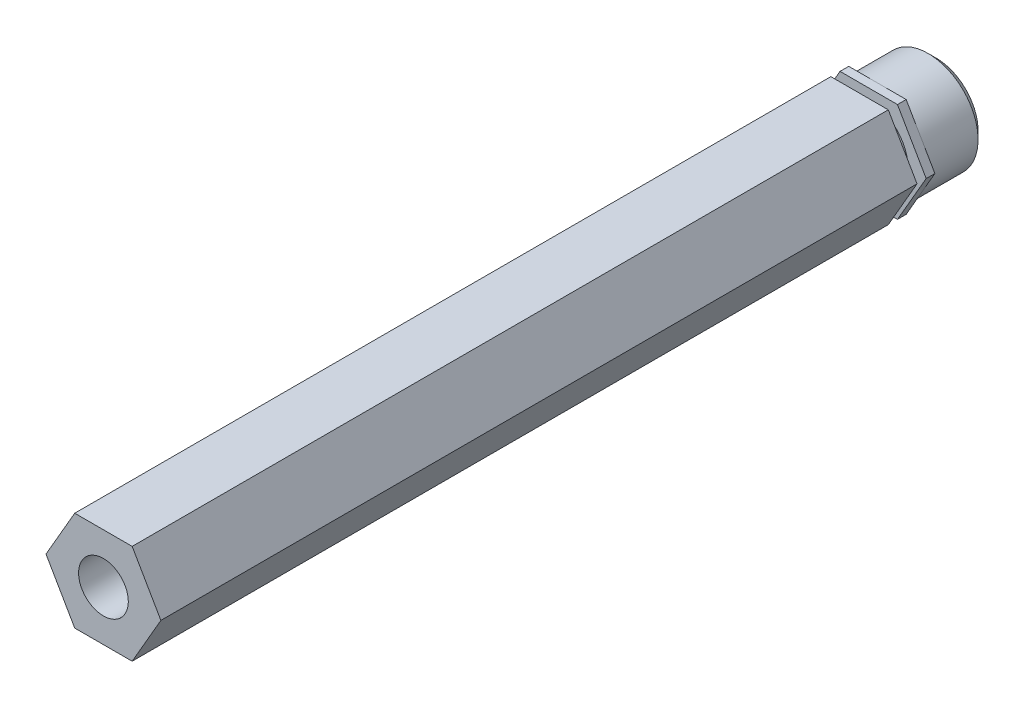
ISO-10303-21;
HEADER;
FILE_DESCRIPTION(('STEP AP214'),'2;1');
FILE_NAME('part.step','',(''),(''),'','','');
FILE_SCHEMA(('AUTOMOTIVE_DESIGN { 1 0 10303 214 1 1 1 1 }'));
ENDSEC;
DATA;
#1=APPLICATION_CONTEXT('core data for automotive mechanical design processes');
#2=APPLICATION_PROTOCOL_DEFINITION('international standard','automotive_design',2000,#1);
#3=PRODUCT_CONTEXT('',#1,'mechanical');
#4=PRODUCT('Part','Part','',(#3));
#5=PRODUCT_RELATED_PRODUCT_CATEGORY('part','',(#4));
#6=PRODUCT_DEFINITION_FORMATION('','',#4);
#7=PRODUCT_DEFINITION_CONTEXT('part definition',#1,'design');
#8=PRODUCT_DEFINITION('design','',#6,#7);
#9=PRODUCT_DEFINITION_SHAPE('','',#8);
#10=(LENGTH_UNIT() NAMED_UNIT(*) SI_UNIT(.MILLI.,.METRE.));
#11=(NAMED_UNIT(*) PLANE_ANGLE_UNIT() SI_UNIT($,.RADIAN.));
#12=(NAMED_UNIT(*) SI_UNIT($,.STERADIAN.) SOLID_ANGLE_UNIT());
#13=UNCERTAINTY_MEASURE_WITH_UNIT(LENGTH_MEASURE(1.E-05),#10,'distance_accuracy_value','');
#14=(GEOMETRIC_REPRESENTATION_CONTEXT(3) GLOBAL_UNCERTAINTY_ASSIGNED_CONTEXT((#13)) GLOBAL_UNIT_ASSIGNED_CONTEXT((#10,
#11,#12)) REPRESENTATION_CONTEXT('',''));
#15=CARTESIAN_POINT('',(0.,0.,0.));
#16=DIRECTION('',(0.,0.,1.));
#17=DIRECTION('',(1.,0.,0.));
#18=AXIS2_PLACEMENT_3D('',#15,#16,#17);
#19=CARTESIAN_POINT('',(0.,0.,-68.704));
#20=DIRECTION('',(0.,0.,-1.));
#21=DIRECTION('',(-1.,0.,0.));
#22=AXIS2_PLACEMENT_3D('',#19,#20,#21);
#23=PLANE('',#22);
#24=CARTESIAN_POINT('',(0.,0.,-68.704));
#25=DIRECTION('',(0.,0.,-1.));
#26=DIRECTION('',(-1.,0.,0.));
#27=AXIS2_PLACEMENT_3D('',#24,#25,#26);
#28=CIRCLE('',#27,6.35);
#29=CARTESIAN_POINT('',(-5.49926131403119,3.175,-68.704));
#30=VERTEX_POINT('',#29);
#31=CARTESIAN_POINT('',(0.,6.35000000000001,-68.704));
#32=VERTEX_POINT('',#31);
#33=EDGE_CURVE('E159',#30,#32,#28,.T.);
#34=ORIENTED_EDGE('',*,*,#33,.F.);
#35=DIRECTION('',(0.5,0.866025403784439,0.));
#36=VECTOR('',#35,1.);
#37=CARTESIAN_POINT('',(-7.33234841870827,0.,-68.704));
#38=LINE('',#37,#36);
#39=CARTESIAN_POINT('',(-3.66617420935412,6.35000000000002,-68.704));
#40=VERTEX_POINT('',#39);
#41=EDGE_CURVE('E147',#30,#40,#38,.T.);
#42=ORIENTED_EDGE('',*,*,#41,.T.);
#43=DIRECTION('',(1.,0.,0.));
#44=VECTOR('',#43,1.);
#45=CARTESIAN_POINT('',(-3.66617420935412,6.35000000000002,-68.704));
#46=LINE('',#45,#44);
#47=EDGE_CURVE('E160',#40,#32,#46,.T.);
#48=ORIENTED_EDGE('',*,*,#47,.T.);
#49=EDGE_LOOP('',(#34,#42,#48));
#50=FACE_BOUND('',#49,.T.);
#51=ADVANCED_FACE('F34',(#50),#23,.T.);
#52=CARTESIAN_POINT('',(5.49926131403118,3.17499999999999,-68.704));
#53=VERTEX_POINT('',#52);
#54=EDGE_CURVE('E166',#32,#53,#28,.T.);
#55=ORIENTED_EDGE('',*,*,#54,.F.);
#56=CARTESIAN_POINT('',(3.66617420935411,6.35000000000001,-68.704));
#57=VERTEX_POINT('',#56);
#58=EDGE_CURVE('E226',#32,#57,#46,.T.);
#59=ORIENTED_EDGE('',*,*,#58,.T.);
#60=DIRECTION('',(0.5,-0.866025403784439,0.));
#61=VECTOR('',#60,1.);
#62=CARTESIAN_POINT('',(3.66617420935411,6.35000000000001,-68.704));
#63=LINE('',#62,#61);
#64=EDGE_CURVE('E247',#57,#53,#63,.T.);
#65=ORIENTED_EDGE('',*,*,#64,.T.);
#66=EDGE_LOOP('',(#55,#59,#65));
#67=FACE_BOUND('',#66,.T.);
#68=ADVANCED_FACE('F308',(#67),#23,.T.);
#69=CARTESIAN_POINT('',(5.49926131403119,-3.17499999999999,-68.704));
#70=VERTEX_POINT('',#69);
#71=EDGE_CURVE('E275',#53,#70,#28,.T.);
#72=ORIENTED_EDGE('',*,*,#71,.F.);
#73=CARTESIAN_POINT('',(7.33234841870824,0.,-68.704));
#74=VERTEX_POINT('',#73);
#75=EDGE_CURVE('E246',#53,#74,#63,.T.);
#76=ORIENTED_EDGE('',*,*,#75,.T.);
#77=DIRECTION('',(-0.499999999999999,-0.866025403784439,0.));
#78=VECTOR('',#77,1.);
#79=CARTESIAN_POINT('',(7.33234841870824,0.,-68.704));
#80=LINE('',#79,#78);
#81=EDGE_CURVE('E251',#74,#70,#80,.T.);
#82=ORIENTED_EDGE('',*,*,#81,.T.);
#83=EDGE_LOOP('',(#72,#76,#82));
#84=FACE_BOUND('',#83,.T.);
#85=ADVANCED_FACE('F285',(#84),#23,.T.);
#86=CARTESIAN_POINT('',(0.,-6.35000000000004,-68.704));
#87=VERTEX_POINT('',#86);
#88=EDGE_CURVE('E170',#70,#87,#28,.T.);
#89=ORIENTED_EDGE('',*,*,#88,.F.);
#90=CARTESIAN_POINT('',(3.6661742093541,-6.35000000000004,-68.704));
#91=VERTEX_POINT('',#90);
#92=EDGE_CURVE('E250',#70,#91,#80,.T.);
#93=ORIENTED_EDGE('',*,*,#92,.T.);
#94=DIRECTION('',(-1.,0.,0.));
#95=VECTOR('',#94,1.);
#96=CARTESIAN_POINT('',(3.6661742093541,-6.35000000000004,-68.704));
#97=LINE('',#96,#95);
#98=EDGE_CURVE('E255',#91,#87,#97,.T.);
#99=ORIENTED_EDGE('',*,*,#98,.T.);
#100=EDGE_LOOP('',(#89,#93,#99));
#101=FACE_BOUND('',#100,.T.);
#102=ADVANCED_FACE('F279',(#101),#23,.T.);
#103=CARTESIAN_POINT('',(-5.4992613140312,-3.17500000000002,-68.704));
#104=VERTEX_POINT('',#103);
#105=EDGE_CURVE('E57',#87,#104,#28,.T.);
#106=ORIENTED_EDGE('',*,*,#105,.F.);
#107=CARTESIAN_POINT('',(-3.66617420935413,-6.35000000000004,-68.704));
#108=VERTEX_POINT('',#107);
#109=EDGE_CURVE('E254',#87,#108,#97,.T.);
#110=ORIENTED_EDGE('',*,*,#109,.T.);
#111=DIRECTION('',(-0.500000000000001,0.866025403784438,0.));
#112=VECTOR('',#111,1.);
#113=CARTESIAN_POINT('',(-3.66617420935413,-6.35000000000004,-68.704));
#114=LINE('',#113,#112);
#115=EDGE_CURVE('E157',#108,#104,#114,.T.);
#116=ORIENTED_EDGE('',*,*,#115,.T.);
#117=EDGE_LOOP('',(#106,#110,#116));
#118=FACE_BOUND('',#117,.T.);
#119=ADVANCED_FACE('F301',(#118),#23,.T.);
#120=CARTESIAN_POINT('',(-3.66617420935412,6.35000000000002,-67.5924));
#121=DIRECTION('',(0.,1.,0.));
#122=DIRECTION('',(-1.,0.,0.));
#123=AXIS2_PLACEMENT_3D('',#120,#121,#122);
#124=PLANE('',#123);
#125=ORIENTED_EDGE('',*,*,#47,.F.);
#126=DIRECTION('',(0.,0.,-1.));
#127=VECTOR('',#126,1.);
#128=CARTESIAN_POINT('',(-3.66617420935412,6.35000000000002,-67.5924));
#129=LINE('',#128,#127);
#130=CARTESIAN_POINT('',(-3.66617420935412,6.35000000000002,-67.5924));
#131=VERTEX_POINT('',#130);
#132=EDGE_CURVE('E153',#131,#40,#129,.T.);
#133=ORIENTED_EDGE('',*,*,#132,.F.);
#134=DIRECTION('',(1.,0.,0.));
#135=VECTOR('',#134,1.);
#136=CARTESIAN_POINT('',(-3.66617420935412,6.35000000000002,-67.5924));
#137=LINE('',#136,#135);
#138=CARTESIAN_POINT('',(3.66617420935411,6.35000000000001,-67.5924));
#139=VERTEX_POINT('',#138);
#140=EDGE_CURVE('E146',#131,#139,#137,.T.);
#141=ORIENTED_EDGE('',*,*,#140,.T.);
#142=DIRECTION('',(0.,0.,-1.));
#143=VECTOR('',#142,1.);
#144=CARTESIAN_POINT('',(3.66617420935411,6.35000000000001,-67.5924));
#145=LINE('',#144,#143);
#146=EDGE_CURVE('E244',#139,#57,#145,.T.);
#147=ORIENTED_EDGE('',*,*,#146,.T.);
#148=ORIENTED_EDGE('',*,*,#58,.F.);
#149=EDGE_LOOP('',(#125,#133,#141,#147,#148));
#150=FACE_BOUND('',#149,.T.);
#151=ADVANCED_FACE('F305',(#150),#124,.T.);
#152=CARTESIAN_POINT('',(-7.33234841870827,0.,-67.5924));
#153=DIRECTION('',(-0.866025403784439,0.5,0.));
#154=DIRECTION('',(-0.5,-0.866025403784439,0.));
#155=AXIS2_PLACEMENT_3D('',#152,#153,#154);
#156=PLANE('',#155);
#157=CARTESIAN_POINT('',(-7.33234841870827,0.,-68.704));
#158=VERTEX_POINT('',#157);
#159=EDGE_CURVE('E140',#158,#30,#38,.T.);
#160=ORIENTED_EDGE('',*,*,#159,.F.);
#161=DIRECTION('',(0.,0.,-1.));
#162=VECTOR('',#161,1.);
#163=CARTESIAN_POINT('',(-7.33234841870827,0.,-67.5924));
#164=LINE('',#163,#162);
#165=CARTESIAN_POINT('',(-7.33234841870827,0.,-67.5924));
#166=VERTEX_POINT('',#165);
#167=EDGE_CURVE('E260',#166,#158,#164,.T.);
#168=ORIENTED_EDGE('',*,*,#167,.F.);
#169=DIRECTION('',(0.5,0.866025403784439,0.));
#170=VECTOR('',#169,1.);
#171=CARTESIAN_POINT('',(-7.33234841870827,0.,-67.5924));
#172=LINE('',#171,#170);
#173=EDGE_CURVE('E242',#166,#131,#172,.T.);
#174=ORIENTED_EDGE('',*,*,#173,.T.);
#175=ORIENTED_EDGE('',*,*,#132,.T.);
#176=ORIENTED_EDGE('',*,*,#41,.F.);
#177=EDGE_LOOP('',(#160,#168,#174,#175,#176));
#178=FACE_BOUND('',#177,.T.);
#179=ADVANCED_FACE('F151',(#178),#156,.T.);
#180=CARTESIAN_POINT('',(-3.66617420935413,-6.35000000000004,-67.5924));
#181=DIRECTION('',(-0.866025403784438,-0.500000000000001,0.));
#182=DIRECTION('',(0.500000000000001,-0.866025403784438,0.));
#183=AXIS2_PLACEMENT_3D('',#180,#181,#182);
#184=PLANE('',#183);
#185=ORIENTED_EDGE('',*,*,#115,.F.);
#186=DIRECTION('',(0.,0.,-1.));
#187=VECTOR('',#186,1.);
#188=CARTESIAN_POINT('',(-3.66617420935413,-6.35000000000004,-67.5924));
#189=LINE('',#188,#187);
#190=CARTESIAN_POINT('',(-3.66617420935413,-6.35000000000004,-67.5924));
#191=VERTEX_POINT('',#190);
#192=EDGE_CURVE('E262',#191,#108,#189,.T.);
#193=ORIENTED_EDGE('',*,*,#192,.F.);
#194=DIRECTION('',(-0.500000000000001,0.866025403784438,0.));
#195=VECTOR('',#194,1.);
#196=CARTESIAN_POINT('',(-3.66617420935413,-6.35000000000004,-67.5924));
#197=LINE('',#196,#195);
#198=EDGE_CURVE('E239',#191,#166,#197,.T.);
#199=ORIENTED_EDGE('',*,*,#198,.T.);
#200=ORIENTED_EDGE('',*,*,#167,.T.);
#201=EDGE_CURVE('E143',#104,#158,#114,.T.);
#202=ORIENTED_EDGE('',*,*,#201,.F.);
#203=EDGE_LOOP('',(#185,#193,#199,#200,#202));
#204=FACE_BOUND('',#203,.T.);
#205=ADVANCED_FACE('F303',(#204),#184,.T.);
#206=CARTESIAN_POINT('',(3.6661742093541,-6.35000000000004,-67.5924));
#207=DIRECTION('',(0.,-1.,0.));
#208=DIRECTION('',(0.,0.,-1.));
#209=AXIS2_PLACEMENT_3D('',#206,#207,#208);
#210=PLANE('',#209);
#211=ORIENTED_EDGE('',*,*,#98,.F.);
#212=DIRECTION('',(0.,0.,-1.));
#213=VECTOR('',#212,1.);
#214=CARTESIAN_POINT('',(3.6661742093541,-6.35000000000004,-67.5924));
#215=LINE('',#214,#213);
#216=CARTESIAN_POINT('',(3.6661742093541,-6.35000000000004,-67.5924));
#217=VERTEX_POINT('',#216);
#218=EDGE_CURVE('E265',#217,#91,#215,.T.);
#219=ORIENTED_EDGE('',*,*,#218,.F.);
#220=DIRECTION('',(-1.,0.,0.));
#221=VECTOR('',#220,1.);
#222=CARTESIAN_POINT('',(3.6661742093541,-6.35000000000004,-67.5924));
#223=LINE('',#222,#221);
#224=EDGE_CURVE('E236',#217,#191,#223,.T.);
#225=ORIENTED_EDGE('',*,*,#224,.T.);
#226=ORIENTED_EDGE('',*,*,#192,.T.);
#227=ORIENTED_EDGE('',*,*,#109,.F.);
#228=EDGE_LOOP('',(#211,#219,#225,#226,#227));
#229=FACE_BOUND('',#228,.T.);
#230=ADVANCED_FACE('F299',(#229),#210,.T.);
#231=CARTESIAN_POINT('',(7.33234841870824,0.,-67.5924));
#232=DIRECTION('',(0.866025403784439,-0.499999999999999,0.));
#233=DIRECTION('',(0.499999999999999,0.866025403784439,0.));
#234=AXIS2_PLACEMENT_3D('',#231,#232,#233);
#235=PLANE('',#234);
#236=ORIENTED_EDGE('',*,*,#81,.F.);
#237=DIRECTION('',(0.,0.,-1.));
#238=VECTOR('',#237,1.);
#239=CARTESIAN_POINT('',(7.33234841870824,0.,-67.5924));
#240=LINE('',#239,#238);
#241=CARTESIAN_POINT('',(7.33234841870824,0.,-67.5924));
#242=VERTEX_POINT('',#241);
#243=EDGE_CURVE('E268',#242,#74,#240,.T.);
#244=ORIENTED_EDGE('',*,*,#243,.F.);
#245=DIRECTION('',(-0.499999999999999,-0.866025403784439,0.));
#246=VECTOR('',#245,1.);
#247=CARTESIAN_POINT('',(7.33234841870824,0.,-67.5924));
#248=LINE('',#247,#246);
#249=EDGE_CURVE('E233',#242,#217,#248,.T.);
#250=ORIENTED_EDGE('',*,*,#249,.T.);
#251=ORIENTED_EDGE('',*,*,#218,.T.);
#252=ORIENTED_EDGE('',*,*,#92,.F.);
#253=EDGE_LOOP('',(#236,#244,#250,#251,#252));
#254=FACE_BOUND('',#253,.T.);
#255=ADVANCED_FACE('F283',(#254),#235,.T.);
#256=CARTESIAN_POINT('',(3.66617420935411,6.35000000000001,-67.5924));
#257=DIRECTION('',(0.866025403784439,0.5,0.));
#258=DIRECTION('',(-0.5,0.866025403784439,0.));
#259=AXIS2_PLACEMENT_3D('',#256,#257,#258);
#260=PLANE('',#259);
#261=ORIENTED_EDGE('',*,*,#64,.F.);
#262=ORIENTED_EDGE('',*,*,#146,.F.);
#263=DIRECTION('',(0.5,-0.866025403784439,0.));
#264=VECTOR('',#263,1.);
#265=CARTESIAN_POINT('',(3.66617420935411,6.35000000000001,-67.5924));
#266=LINE('',#265,#264);
#267=EDGE_CURVE('E230',#139,#242,#266,.T.);
#268=ORIENTED_EDGE('',*,*,#267,.T.);
#269=ORIENTED_EDGE('',*,*,#243,.T.);
#270=ORIENTED_EDGE('',*,*,#75,.F.);
#271=EDGE_LOOP('',(#261,#262,#268,#269,#270));
#272=FACE_BOUND('',#271,.T.);
#273=ADVANCED_FACE('F289',(#272),#260,.T.);
#274=CARTESIAN_POINT('',(0.,0.,-67.5924));
#275=DIRECTION('',(0.,0.,-1.));
#276=DIRECTION('',(-1.,0.,0.));
#277=AXIS2_PLACEMENT_3D('',#274,#275,#276);
#278=PLANE('',#277);
#279=CARTESIAN_POINT('',(0.,0.,-67.5924));
#280=DIRECTION('',(0.,0.,1.));
#281=DIRECTION('',(1.,0.,0.));
#282=AXIS2_PLACEMENT_3D('',#279,#280,#281);
#283=CIRCLE('',#282,5.0292);
#284=CARTESIAN_POINT('',(5.0292,0.,-67.5924));
#285=VERTEX_POINT('',#284);
#286=EDGE_CURVE('E169',#285,#285,#283,.T.);
#287=ORIENTED_EDGE('',*,*,#286,.F.);
#288=EDGE_LOOP('',(#287));
#289=FACE_BOUND('',#288,.T.);
#290=ORIENTED_EDGE('',*,*,#140,.F.);
#291=ORIENTED_EDGE('',*,*,#173,.F.);
#292=ORIENTED_EDGE('',*,*,#198,.F.);
#293=ORIENTED_EDGE('',*,*,#224,.F.);
#294=ORIENTED_EDGE('',*,*,#249,.F.);
#295=ORIENTED_EDGE('',*,*,#267,.F.);
#296=EDGE_LOOP('',(#290,#291,#292,#293,#294,#295));
#297=FACE_BOUND('',#296,.T.);
#298=ADVANCED_FACE('F295',(#289,#297),#278,.F.);
#299=EDGE_CURVE('E49',#104,#30,#28,.T.);
#300=ORIENTED_EDGE('',*,*,#299,.F.);
#301=ORIENTED_EDGE('',*,*,#201,.T.);
#302=ORIENTED_EDGE('',*,*,#159,.T.);
#303=EDGE_LOOP('',(#300,#301,#302));
#304=FACE_BOUND('',#303,.T.);
#305=ADVANCED_FACE('F142',(#304),#23,.T.);
#306=CARTESIAN_POINT('',(0.,0.,-66.424));
#307=DIRECTION('',(0.,0.,-1.));
#308=DIRECTION('',(-1.,0.,0.));
#309=AXIS2_PLACEMENT_3D('',#306,#307,#308);
#310=CYLINDRICAL_SURFACE('',#309,5.0292);
#311=CARTESIAN_POINT('',(0.,0.,-66.424));
#312=DIRECTION('',(0.,0.,1.));
#313=DIRECTION('',(1.,0.,0.));
#314=AXIS2_PLACEMENT_3D('',#311,#312,#313);
#315=CIRCLE('',#314,5.0292);
#316=CARTESIAN_POINT('',(5.0292,0.,-66.424));
#317=VERTEX_POINT('',#316);
#318=EDGE_CURVE('E215',#317,#317,#315,.T.);
#319=ORIENTED_EDGE('',*,*,#318,.F.);
#320=EDGE_LOOP('',(#319));
#321=FACE_BOUND('',#320,.T.);
#322=ORIENTED_EDGE('',*,*,#286,.T.);
#323=EDGE_LOOP('',(#322));
#324=FACE_BOUND('',#323,.T.);
#325=ADVANCED_FACE('F318',(#321,#324),#310,.T.);
#326=CARTESIAN_POINT('',(3.6661742093541,-6.35000000000004,30.096));
#327=DIRECTION('',(0.,-1.,0.));
#328=DIRECTION('',(0.,0.,-1.));
#329=AXIS2_PLACEMENT_3D('',#326,#327,#328);
#330=PLANE('',#329);
#331=DIRECTION('',(-1.,0.,0.));
#332=VECTOR('',#331,1.);
#333=CARTESIAN_POINT('',(3.6661742093541,-6.35000000000004,-66.424));
#334=LINE('',#333,#332);
#335=CARTESIAN_POINT('',(3.6661742093541,-6.35000000000004,-66.424));
#336=VERTEX_POINT('',#335);
#337=CARTESIAN_POINT('',(-3.66617420935413,-6.35000000000004,-66.424));
#338=VERTEX_POINT('',#337);
#339=EDGE_CURVE('E163',#336,#338,#334,.T.);
#340=ORIENTED_EDGE('',*,*,#339,.F.);
#341=DIRECTION('',(0.,0.,-1.));
#342=VECTOR('',#341,1.);
#343=CARTESIAN_POINT('',(3.6661742093541,-6.35000000000004,30.096));
#344=LINE('',#343,#342);
#345=CARTESIAN_POINT('',(3.6661742093541,-6.35000000000004,30.096));
#346=VERTEX_POINT('',#345);
#347=EDGE_CURVE('E213',#346,#336,#344,.T.);
#348=ORIENTED_EDGE('',*,*,#347,.F.);
#349=DIRECTION('',(-1.,0.,0.));
#350=VECTOR('',#349,1.);
#351=CARTESIAN_POINT('',(3.6661742093541,-6.35000000000004,30.096));
#352=LINE('',#351,#350);
#353=CARTESIAN_POINT('',(-3.66617420935413,-6.35000000000004,30.096));
#354=VERTEX_POINT('',#353);
#355=EDGE_CURVE('E177',#346,#354,#352,.T.);
#356=ORIENTED_EDGE('',*,*,#355,.T.);
#357=DIRECTION('',(0.,0.,-1.));
#358=VECTOR('',#357,1.);
#359=CARTESIAN_POINT('',(-3.66617420935413,-6.35000000000004,30.096));
#360=LINE('',#359,#358);
#361=EDGE_CURVE('E196',#354,#338,#360,.T.);
#362=ORIENTED_EDGE('',*,*,#361,.T.);
#363=EDGE_LOOP('',(#340,#348,#356,#362));
#364=FACE_BOUND('',#363,.T.);
#365=ADVANCED_FACE('F418',(#364),#330,.T.);
#366=CARTESIAN_POINT('',(7.33234841870824,0.,30.096));
#367=DIRECTION('',(0.866025403784439,-0.499999999999999,0.));
#368=DIRECTION('',(0.499999999999999,0.866025403784439,0.));
#369=AXIS2_PLACEMENT_3D('',#366,#367,#368);
#370=PLANE('',#369);
#371=DIRECTION('',(-0.499999999999999,-0.866025403784439,0.));
#372=VECTOR('',#371,1.);
#373=CARTESIAN_POINT('',(7.33234841870824,0.,-66.424));
#374=LINE('',#373,#372);
#375=CARTESIAN_POINT('',(7.33234841870824,0.,-66.424));
#376=VERTEX_POINT('',#375);
#377=EDGE_CURVE('E181',#376,#336,#374,.T.);
#378=ORIENTED_EDGE('',*,*,#377,.F.);
#379=DIRECTION('',(0.,0.,-1.));
#380=VECTOR('',#379,1.);
#381=CARTESIAN_POINT('',(7.33234841870824,0.,30.096));
#382=LINE('',#381,#380);
#383=CARTESIAN_POINT('',(7.33234841870824,0.,30.096));
#384=VERTEX_POINT('',#383);
#385=EDGE_CURVE('E216',#384,#376,#382,.T.);
#386=ORIENTED_EDGE('',*,*,#385,.F.);
#387=DIRECTION('',(-0.499999999999999,-0.866025403784439,0.));
#388=VECTOR('',#387,1.);
#389=CARTESIAN_POINT('',(7.33234841870824,0.,30.096));
#390=LINE('',#389,#388);
#391=EDGE_CURVE('E193',#384,#346,#390,.T.);
#392=ORIENTED_EDGE('',*,*,#391,.T.);
#393=ORIENTED_EDGE('',*,*,#347,.T.);
#394=EDGE_LOOP('',(#378,#386,#392,#393));
#395=FACE_BOUND('',#394,.T.);
#396=ADVANCED_FACE('F408',(#395),#370,.T.);
#397=CARTESIAN_POINT('',(3.6661742093541,6.35000000000001,30.096));
#398=DIRECTION('',(0.866025403784439,0.5,0.));
#399=DIRECTION('',(-0.5,0.866025403784439,0.));
#400=AXIS2_PLACEMENT_3D('',#397,#398,#399);
#401=PLANE('',#400);
#402=DIRECTION('',(0.5,-0.866025403784439,0.));
#403=VECTOR('',#402,1.);
#404=CARTESIAN_POINT('',(3.6661742093541,6.35000000000001,-66.424));
#405=LINE('',#404,#403);
#406=CARTESIAN_POINT('',(3.6661742093541,6.35000000000001,-66.424));
#407=VERTEX_POINT('',#406);
#408=EDGE_CURVE('E208',#407,#376,#405,.T.);
#409=ORIENTED_EDGE('',*,*,#408,.F.);
#410=DIRECTION('',(0.,0.,-1.));
#411=VECTOR('',#410,1.);
#412=CARTESIAN_POINT('',(3.6661742093541,6.35000000000001,30.096));
#413=LINE('',#412,#411);
#414=CARTESIAN_POINT('',(3.6661742093541,6.35000000000001,30.096));
#415=VERTEX_POINT('',#414);
#416=EDGE_CURVE('E218',#415,#407,#413,.T.);
#417=ORIENTED_EDGE('',*,*,#416,.F.);
#418=DIRECTION('',(0.5,-0.866025403784439,0.));
#419=VECTOR('',#418,1.);
#420=CARTESIAN_POINT('',(3.6661742093541,6.35000000000001,30.096));
#421=LINE('',#420,#419);
#422=EDGE_CURVE('E190',#415,#384,#421,.T.);
#423=ORIENTED_EDGE('',*,*,#422,.T.);
#424=ORIENTED_EDGE('',*,*,#385,.T.);
#425=EDGE_LOOP('',(#409,#417,#423,#424));
#426=FACE_BOUND('',#425,.T.);
#427=ADVANCED_FACE('F398',(#426),#401,.T.);
#428=CARTESIAN_POINT('',(-3.66617420935412,6.35000000000002,30.096));
#429=DIRECTION('',(0.,1.,0.));
#430=DIRECTION('',(-1.,0.,0.));
#431=AXIS2_PLACEMENT_3D('',#428,#429,#430);
#432=PLANE('',#431);
#433=DIRECTION('',(1.,0.,0.));
#434=VECTOR('',#433,1.);
#435=CARTESIAN_POINT('',(-3.66617420935412,6.35000000000002,-66.424));
#436=LINE('',#435,#434);
#437=CARTESIAN_POINT('',(-3.66617420935412,6.35000000000002,-66.424));
#438=VERTEX_POINT('',#437);
#439=EDGE_CURVE('E205',#438,#407,#436,.T.);
#440=ORIENTED_EDGE('',*,*,#439,.F.);
#441=DIRECTION('',(0.,0.,-1.));
#442=VECTOR('',#441,1.);
#443=CARTESIAN_POINT('',(-3.66617420935412,6.35000000000002,30.096));
#444=LINE('',#443,#442);
#445=CARTESIAN_POINT('',(-3.66617420935412,6.35000000000002,30.096));
#446=VERTEX_POINT('',#445);
#447=EDGE_CURVE('E220',#446,#438,#444,.T.);
#448=ORIENTED_EDGE('',*,*,#447,.F.);
#449=DIRECTION('',(1.,0.,0.));
#450=VECTOR('',#449,1.);
#451=CARTESIAN_POINT('',(-3.66617420935412,6.35000000000002,30.096));
#452=LINE('',#451,#450);
#453=EDGE_CURVE('E187',#446,#415,#452,.T.);
#454=ORIENTED_EDGE('',*,*,#453,.T.);
#455=ORIENTED_EDGE('',*,*,#416,.T.);
#456=EDGE_LOOP('',(#440,#448,#454,#455));
#457=FACE_BOUND('',#456,.T.);
#458=ADVANCED_FACE('F388',(#457),#432,.T.);
#459=CARTESIAN_POINT('',(-7.33234841870827,0.,30.096));
#460=DIRECTION('',(-0.866025403784439,0.5,0.));
#461=DIRECTION('',(-0.5,-0.866025403784439,0.));
#462=AXIS2_PLACEMENT_3D('',#459,#460,#461);
#463=PLANE('',#462);
#464=DIRECTION('',(0.5,0.866025403784439,0.));
#465=VECTOR('',#464,1.);
#466=CARTESIAN_POINT('',(-7.33234841870827,0.,-66.424));
#467=LINE('',#466,#465);
#468=CARTESIAN_POINT('',(-7.33234841870827,0.,-66.424));
#469=VERTEX_POINT('',#468);
#470=EDGE_CURVE('E202',#469,#438,#467,.T.);
#471=ORIENTED_EDGE('',*,*,#470,.F.);
#472=DIRECTION('',(0.,0.,-1.));
#473=VECTOR('',#472,1.);
#474=CARTESIAN_POINT('',(-7.33234841870827,0.,30.096));
#475=LINE('',#474,#473);
#476=CARTESIAN_POINT('',(-7.33234841870827,0.,30.096));
#477=VERTEX_POINT('',#476);
#478=EDGE_CURVE('E222',#477,#469,#475,.T.);
#479=ORIENTED_EDGE('',*,*,#478,.F.);
#480=DIRECTION('',(0.5,0.866025403784439,0.));
#481=VECTOR('',#480,1.);
#482=CARTESIAN_POINT('',(-7.33234841870827,0.,30.096));
#483=LINE('',#482,#481);
#484=EDGE_CURVE('E184',#477,#446,#483,.T.);
#485=ORIENTED_EDGE('',*,*,#484,.T.);
#486=ORIENTED_EDGE('',*,*,#447,.T.);
#487=EDGE_LOOP('',(#471,#479,#485,#486));
#488=FACE_BOUND('',#487,.T.);
#489=ADVANCED_FACE('F378',(#488),#463,.T.);
#490=CARTESIAN_POINT('',(-3.66617420935413,-6.35000000000004,30.096));
#491=DIRECTION('',(-0.866025403784438,-0.500000000000001,0.));
#492=DIRECTION('',(0.500000000000001,-0.866025403784438,0.));
#493=AXIS2_PLACEMENT_3D('',#490,#491,#492);
#494=PLANE('',#493);
#495=DIRECTION('',(-0.500000000000001,0.866025403784438,0.));
#496=VECTOR('',#495,1.);
#497=CARTESIAN_POINT('',(-3.66617420935413,-6.35000000000004,-66.424));
#498=LINE('',#497,#496);
#499=EDGE_CURVE('E199',#338,#469,#498,.T.);
#500=ORIENTED_EDGE('',*,*,#499,.F.);
#501=ORIENTED_EDGE('',*,*,#361,.F.);
#502=DIRECTION('',(-0.500000000000001,0.866025403784438,0.));
#503=VECTOR('',#502,1.);
#504=CARTESIAN_POINT('',(-3.66617420935413,-6.35000000000004,30.096));
#505=LINE('',#504,#503);
#506=EDGE_CURVE('E180',#354,#477,#505,.T.);
#507=ORIENTED_EDGE('',*,*,#506,.T.);
#508=ORIENTED_EDGE('',*,*,#478,.T.);
#509=EDGE_LOOP('',(#500,#501,#507,#508));
#510=FACE_BOUND('',#509,.T.);
#511=ADVANCED_FACE('F373',(#510),#494,.T.);
#512=CARTESIAN_POINT('',(0.,0.,30.096));
#513=DIRECTION('',(0.,0.,-1.));
#514=DIRECTION('',(-1.,0.,0.));
#515=AXIS2_PLACEMENT_3D('',#512,#513,#514);
#516=PLANE('',#515);
#517=CARTESIAN_POINT('',(0.,0.,30.096));
#518=DIRECTION('',(0.,0.,1.));
#519=DIRECTION('',(1.,0.,0.));
#520=AXIS2_PLACEMENT_3D('',#517,#518,#519);
#521=CIRCLE('',#520,3.175);
#522=CARTESIAN_POINT('',(3.175,0.,30.096));
#523=VERTEX_POINT('',#522);
#524=EDGE_CURVE('E175',#523,#523,#521,.T.);
#525=ORIENTED_EDGE('',*,*,#524,.F.);
#526=EDGE_LOOP('',(#525));
#527=FACE_BOUND('',#526,.T.);
#528=ORIENTED_EDGE('',*,*,#355,.F.);
#529=ORIENTED_EDGE('',*,*,#391,.F.);
#530=ORIENTED_EDGE('',*,*,#422,.F.);
#531=ORIENTED_EDGE('',*,*,#453,.F.);
#532=ORIENTED_EDGE('',*,*,#484,.F.);
#533=ORIENTED_EDGE('',*,*,#506,.F.);
#534=EDGE_LOOP('',(#528,#529,#530,#531,#532,#533));
#535=FACE_BOUND('',#534,.T.);
#536=ADVANCED_FACE('F363',(#527,#535),#516,.F.);
#537=CARTESIAN_POINT('',(0.,0.,-66.424));
#538=DIRECTION('',(0.,0.,-1.));
#539=DIRECTION('',(-1.,0.,0.));
#540=AXIS2_PLACEMENT_3D('',#537,#538,#539);
#541=PLANE('',#540);
#542=ORIENTED_EDGE('',*,*,#318,.T.);
#543=EDGE_LOOP('',(#542));
#544=FACE_BOUND('',#543,.T.);
#545=ORIENTED_EDGE('',*,*,#339,.T.);
#546=ORIENTED_EDGE('',*,*,#499,.T.);
#547=ORIENTED_EDGE('',*,*,#470,.T.);
#548=ORIENTED_EDGE('',*,*,#439,.T.);
#549=ORIENTED_EDGE('',*,*,#408,.T.);
#550=ORIENTED_EDGE('',*,*,#377,.T.);
#551=EDGE_LOOP('',(#545,#546,#547,#548,#549,#550));
#552=FACE_BOUND('',#551,.T.);
#553=ADVANCED_FACE('F358',(#544,#552),#541,.T.);
#554=CARTESIAN_POINT('',(0.,0.,-68.704));
#555=DIRECTION('',(0.,0.,-1.));
#556=DIRECTION('',(-1.,0.,0.));
#557=AXIS2_PLACEMENT_3D('',#554,#555,#556);
#558=CYLINDRICAL_SURFACE('',#557,6.35);
#559=CARTESIAN_POINT('',(0.,0.,-75.2000000000248));
#560=DIRECTION('',(0.,0.,-1.));
#561=DIRECTION('',(-1.,0.,0.));
#562=AXIS2_PLACEMENT_3D('',#559,#560,#561);
#563=CIRCLE('',#562,6.35);
#564=CARTESIAN_POINT('',(-6.35,0.,-75.2000000000248));
#565=VERTEX_POINT('',#564);
#566=EDGE_CURVE('E11',#565,#565,#563,.F.);
#567=ORIENTED_EDGE('',*,*,#566,.T.);
#568=EDGE_LOOP('',(#567));
#569=FACE_BOUND('',#568,.T.);
#570=ORIENTED_EDGE('',*,*,#33,.T.);
#571=ORIENTED_EDGE('',*,*,#54,.T.);
#572=ORIENTED_EDGE('',*,*,#71,.T.);
#573=ORIENTED_EDGE('',*,*,#88,.T.);
#574=ORIENTED_EDGE('',*,*,#105,.T.);
#575=ORIENTED_EDGE('',*,*,#299,.T.);
#576=EDGE_LOOP('',(#570,#571,#572,#573,#574,#575));
#577=FACE_BOUND('',#576,.T.);
#578=ADVANCED_FACE('F167',(#569,#577),#558,.T.);
#579=CARTESIAN_POINT('',(0.,0.,-76.2));
#580=DIRECTION('',(0.,0.,-1.));
#581=DIRECTION('',(-1.,0.,0.));
#582=AXIS2_PLACEMENT_3D('',#579,#580,#581);
#583=PLANE('',#582);
#584=CARTESIAN_POINT('',(0.,0.,-76.2));
#585=DIRECTION('',(0.,0.,-1.));
#586=DIRECTION('',(-1.,0.,0.));
#587=AXIS2_PLACEMENT_3D('',#584,#585,#586);
#588=CIRCLE('',#587,5.35000000002482);
#589=CARTESIAN_POINT('',(-5.35000000002482,0.,-76.2));
#590=VERTEX_POINT('',#589);
#591=EDGE_CURVE('E42',#590,#590,#588,.T.);
#592=ORIENTED_EDGE('',*,*,#591,.T.);
#593=EDGE_LOOP('',(#592));
#594=FACE_BOUND('',#593,.T.);
#595=ADVANCED_FACE('F462',(#594),#583,.T.);
#596=CARTESIAN_POINT('',(0.,0.,-76.2));
#597=DIRECTION('',(0.,0.,1.));
#598=DIRECTION('',(1.,0.,0.));
#599=AXIS2_PLACEMENT_3D('',#596,#597,#598);
#600=CONICAL_SURFACE('',#599,5.35000000002482,0.785398163397451);
#601=ORIENTED_EDGE('',*,*,#566,.F.);
#602=EDGE_LOOP('',(#601));
#603=FACE_BOUND('',#602,.T.);
#604=ORIENTED_EDGE('',*,*,#591,.F.);
#605=EDGE_LOOP('',(#604));
#606=FACE_BOUND('',#605,.T.);
#607=ADVANCED_FACE('F36',(#603,#606),#600,.T.);
#608=CARTESIAN_POINT('',(0.,0.,20.571));
#609=DIRECTION('',(0.,0.,1.));
#610=DIRECTION('',(1.,0.,0.));
#611=AXIS2_PLACEMENT_3D('',#608,#609,#610);
#612=CYLINDRICAL_SURFACE('',#611,3.175);
#613=CARTESIAN_POINT('',(0.,0.,20.571));
#614=DIRECTION('',(0.,0.,1.));
#615=DIRECTION('',(1.,0.,0.));
#616=AXIS2_PLACEMENT_3D('',#613,#614,#615);
#617=CIRCLE('',#616,3.175);
#618=CARTESIAN_POINT('',(3.175,0.,20.571));
#619=VERTEX_POINT('',#618);
#620=EDGE_CURVE('E164',#619,#619,#617,.T.);
#621=CARTESIAN_POINT('',(3.175,0.,20.571));
#622=CARTESIAN_POINT('',(3.175,0.,20.67021875));
#623=CARTESIAN_POINT('',(3.175,0.,20.7694375));
#624=CARTESIAN_POINT('',(3.175,0.,20.967875));
#625=CARTESIAN_POINT('',(3.175,0.,21.06709375));
#626=CARTESIAN_POINT('',(3.175,0.,21.26553125));
#627=CARTESIAN_POINT('',(3.175,0.,21.36475));
#628=CARTESIAN_POINT('',(3.175,0.,21.5631875));
#629=CARTESIAN_POINT('',(3.175,0.,21.66240625));
#630=CARTESIAN_POINT('',(3.175,0.,21.86084375));
#631=CARTESIAN_POINT('',(3.175,0.,21.9600625));
#632=CARTESIAN_POINT('',(3.175,0.,22.1585));
#633=CARTESIAN_POINT('',(3.175,0.,22.25771875));
#634=CARTESIAN_POINT('',(3.175,0.,22.45615625));
#635=CARTESIAN_POINT('',(3.175,0.,22.555375));
#636=CARTESIAN_POINT('',(3.175,0.,22.7538125));
#637=CARTESIAN_POINT('',(3.175,0.,22.85303125));
#638=CARTESIAN_POINT('',(3.175,0.,23.05146875));
#639=CARTESIAN_POINT('',(3.175,0.,23.1506875));
#640=CARTESIAN_POINT('',(3.175,0.,23.349125));
#641=CARTESIAN_POINT('',(3.175,0.,23.44834375));
#642=CARTESIAN_POINT('',(3.175,0.,23.64678125));
#643=CARTESIAN_POINT('',(3.175,0.,23.746));
#644=CARTESIAN_POINT('',(3.175,0.,23.9444375));
#645=CARTESIAN_POINT('',(3.175,0.,24.04365625));
#646=CARTESIAN_POINT('',(3.175,0.,24.24209375));
#647=CARTESIAN_POINT('',(3.175,0.,24.3413125));
#648=CARTESIAN_POINT('',(3.175,0.,24.53975));
#649=CARTESIAN_POINT('',(3.175,0.,24.63896875));
#650=CARTESIAN_POINT('',(3.175,0.,24.83740625));
#651=CARTESIAN_POINT('',(3.175,0.,24.936625));
#652=CARTESIAN_POINT('',(3.175,0.,25.1350625));
#653=CARTESIAN_POINT('',(3.175,0.,25.23428125));
#654=CARTESIAN_POINT('',(3.175,0.,25.43271875));
#655=CARTESIAN_POINT('',(3.175,0.,25.5319375));
#656=CARTESIAN_POINT('',(3.175,0.,25.730375));
#657=CARTESIAN_POINT('',(3.175,0.,25.82959375));
#658=CARTESIAN_POINT('',(3.175,0.,26.02803125));
#659=CARTESIAN_POINT('',(3.175,0.,26.12725));
#660=CARTESIAN_POINT('',(3.175,0.,26.3256875));
#661=CARTESIAN_POINT('',(3.175,0.,26.42490625));
#662=CARTESIAN_POINT('',(3.175,0.,26.62334375));
#663=CARTESIAN_POINT('',(3.175,0.,26.7225625));
#664=CARTESIAN_POINT('',(3.175,0.,26.921));
#665=CARTESIAN_POINT('',(3.175,0.,27.02021875));
#666=CARTESIAN_POINT('',(3.175,0.,27.21865625));
#667=CARTESIAN_POINT('',(3.175,0.,27.317875));
#668=CARTESIAN_POINT('',(3.175,0.,27.5163125));
#669=CARTESIAN_POINT('',(3.175,0.,27.61553125));
#670=CARTESIAN_POINT('',(3.175,0.,27.81396875));
#671=CARTESIAN_POINT('',(3.175,0.,27.9131875));
#672=CARTESIAN_POINT('',(3.175,0.,28.111625));
#673=CARTESIAN_POINT('',(3.175,0.,28.21084375));
#674=CARTESIAN_POINT('',(3.175,0.,28.40928125));
#675=CARTESIAN_POINT('',(3.175,0.,28.5085));
#676=CARTESIAN_POINT('',(3.175,0.,28.7069375));
#677=CARTESIAN_POINT('',(3.175,0.,28.80615625));
#678=CARTESIAN_POINT('',(3.175,0.,29.00459375));
#679=CARTESIAN_POINT('',(3.175,0.,29.1038125));
#680=CARTESIAN_POINT('',(3.175,0.,29.30225));
#681=CARTESIAN_POINT('',(3.175,0.,29.40146875));
#682=CARTESIAN_POINT('',(3.175,0.,29.59990625));
#683=CARTESIAN_POINT('',(3.175,0.,29.699125));
#684=CARTESIAN_POINT('',(3.175,0.,29.8975625));
#685=CARTESIAN_POINT('',(3.175,0.,29.99678125));
#686=CARTESIAN_POINT('',(3.175,0.,30.096));
#687=B_SPLINE_CURVE_WITH_KNOTS('',3,(#621,#622,#623,#624,#625,#626,#627,#628,#629,#630,#631,
#632,#633,#634,#635,#636,#637,#638,#639,#640,#641,#642,#643,#644,#645,#646,#647,#648,#649,#650,
#651,#652,#653,#654,#655,#656,#657,#658,#659,#660,#661,#662,#663,#664,#665,#666,#667,#668,#669,
#670,#671,#672,#673,#674,#675,#676,#677,#678,#679,#680,#681,#682,#683,#684,#685,#686),
.UNSPECIFIED.,.F.,.F.,(4,2,2,2,2,2,2,2,2,2,2,2,2,2,2,2,2,2,2,2,2,2,2,2,2,2,2,2,2,2,2,2,4),(0.,
0.29765625,0.5953125,0.892968750000001,1.190625,1.48828125,1.7859375,2.08359375,2.38125,
2.67890625,2.9765625,3.27421875,3.571875,3.86953125,4.1671875,4.46484375,4.7625,5.06015625,
5.3578125,5.65546875,5.953125,6.25078125,6.5484375,6.84609375,7.14375,7.44140625,7.7390625,
8.03671875,8.334375,8.63203125,8.9296875,9.22734375,9.525),.UNSPECIFIED.);
#688=EDGE_CURVE('BSEAM480',#619,#523,#687,.T.);
#689=ORIENTED_EDGE('',*,*,#620,.F.);
#690=ORIENTED_EDGE('',*,*,#524,.T.);
#691=ORIENTED_EDGE('',*,*,#688,.T.);
#692=ORIENTED_EDGE('',*,*,#688,.F.);
#693=EDGE_LOOP('',(#689,#691,#690,#692));
#694=FACE_BOUND('',#693,.T.);
#695=ADVANCED_FACE('F480',(#694),#612,.F.);
#696=CARTESIAN_POINT('',(0.,0.,20.571));
#697=DIRECTION('',(0.,0.,1.));
#698=DIRECTION('',(1.,0.,0.));
#699=AXIS2_PLACEMENT_3D('',#696,#697,#698);
#700=PLANE('',#699);
#701=ORIENTED_EDGE('',*,*,#620,.T.);
#702=EDGE_LOOP('',(#701));
#703=FACE_BOUND('',#702,.T.);
#704=ADVANCED_FACE('F496',(#703),#700,.T.);
#705=CLOSED_SHELL('',(#51,#68,#85,#102,#119,#151,#179,#205,#230,#255,#273,#298,#305,#325,#365,
#396,#427,#458,#489,#511,#536,#553,#578,#595,#607,#695,#704));
#706=MANIFOLD_SOLID_BREP('B2',#705);
#707=ADVANCED_BREP_SHAPE_REPRESENTATION('',(#18,#706),#14);
#708=SHAPE_DEFINITION_REPRESENTATION(#9,#707);
ENDSEC;
END-ISO-10303-21;
